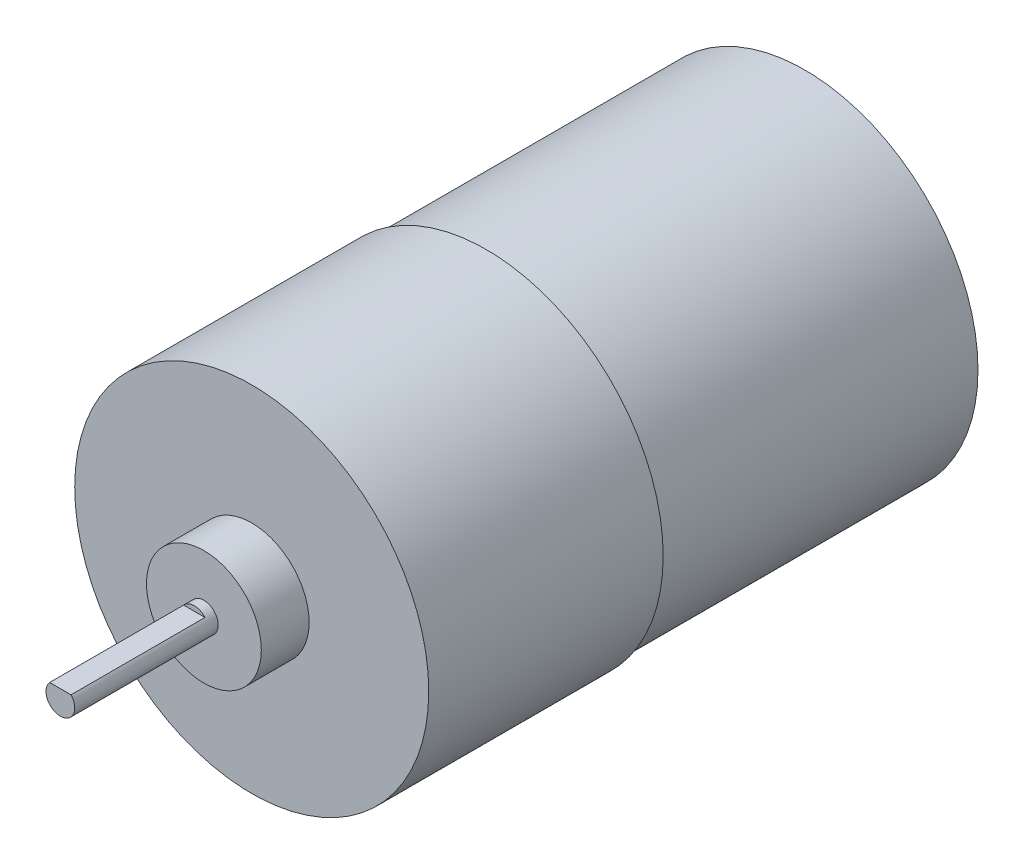
ISO-10303-21;
HEADER;
FILE_DESCRIPTION(('STEP AP214'),'2;1');
FILE_NAME('part.step','',(''),(''),'','','');
FILE_SCHEMA(('AUTOMOTIVE_DESIGN { 1 0 10303 214 1 1 1 1 }'));
ENDSEC;
DATA;
#1=APPLICATION_CONTEXT('core data for automotive mechanical design processes');
#2=APPLICATION_PROTOCOL_DEFINITION('international standard','automotive_design',2000,#1);
#3=PRODUCT_CONTEXT('',#1,'mechanical');
#4=PRODUCT('Part','Part','',(#3));
#5=PRODUCT_RELATED_PRODUCT_CATEGORY('part','',(#4));
#6=PRODUCT_DEFINITION_FORMATION('','',#4);
#7=PRODUCT_DEFINITION_CONTEXT('part definition',#1,'design');
#8=PRODUCT_DEFINITION('design','',#6,#7);
#9=PRODUCT_DEFINITION_SHAPE('','',#8);
#10=(LENGTH_UNIT() NAMED_UNIT(*) SI_UNIT(.MILLI.,.METRE.));
#11=(NAMED_UNIT(*) PLANE_ANGLE_UNIT() SI_UNIT($,.RADIAN.));
#12=(NAMED_UNIT(*) SI_UNIT($,.STERADIAN.) SOLID_ANGLE_UNIT());
#13=UNCERTAINTY_MEASURE_WITH_UNIT(LENGTH_MEASURE(1.E-05),#10,'distance_accuracy_value','');
#14=(GEOMETRIC_REPRESENTATION_CONTEXT(3) GLOBAL_UNCERTAINTY_ASSIGNED_CONTEXT((#13)) GLOBAL_UNIT_ASSIGNED_CONTEXT((#10,
#11,#12)) REPRESENTATION_CONTEXT('',''));
#15=CARTESIAN_POINT('',(0.,0.,0.));
#16=DIRECTION('',(0.,0.,1.));
#17=DIRECTION('',(1.,0.,0.));
#18=AXIS2_PLACEMENT_3D('',#15,#16,#17);
#19=CARTESIAN_POINT('',(0.,0.,33.3));
#20=DIRECTION('',(0.,0.,-1.));
#21=DIRECTION('',(-1.,0.,0.));
#22=AXIS2_PLACEMENT_3D('',#19,#20,#21);
#23=CYLINDRICAL_SURFACE('',#22,18.099999995);
#24=CARTESIAN_POINT('',(0.,0.,33.3));
#25=DIRECTION('',(0.,0.,1.));
#26=DIRECTION('',(1.,0.,0.));
#27=AXIS2_PLACEMENT_3D('',#24,#25,#26);
#28=CIRCLE('',#27,18.099999995);
#29=CARTESIAN_POINT('',(18.099999995,0.,33.3));
#30=VERTEX_POINT('',#29);
#31=EDGE_CURVE('E82',#30,#30,#28,.T.);
#32=ORIENTED_EDGE('',*,*,#31,.F.);
#33=EDGE_LOOP('',(#32));
#34=FACE_BOUND('',#33,.T.);
#35=CARTESIAN_POINT('',(0.,0.,0.));
#36=DIRECTION('',(0.,0.,1.));
#37=DIRECTION('',(1.,0.,0.));
#38=AXIS2_PLACEMENT_3D('',#35,#36,#37);
#39=CIRCLE('',#38,18.099999995);
#40=CARTESIAN_POINT('',(18.099999995,0.,0.));
#41=VERTEX_POINT('',#40);
#42=EDGE_CURVE('E35',#41,#41,#39,.T.);
#43=ORIENTED_EDGE('',*,*,#42,.T.);
#44=EDGE_LOOP('',(#43));
#45=FACE_BOUND('',#44,.T.);
#46=ADVANCED_FACE('F32',(#34,#45),#23,.T.);
#47=CARTESIAN_POINT('',(0.,0.,0.));
#48=DIRECTION('',(0.,0.,1.));
#49=DIRECTION('',(1.,0.,0.));
#50=AXIS2_PLACEMENT_3D('',#47,#48,#49);
#51=PLANE('',#50);
#52=ORIENTED_EDGE('',*,*,#42,.F.);
#53=EDGE_LOOP('',(#52));
#54=FACE_BOUND('',#53,.T.);
#55=ADVANCED_FACE('F94',(#54),#51,.F.);
#56=CARTESIAN_POINT('',(0.,0.,57.8));
#57=DIRECTION('',(0.,0.,-1.));
#58=DIRECTION('',(-1.,0.,0.));
#59=AXIS2_PLACEMENT_3D('',#56,#57,#58);
#60=CYLINDRICAL_SURFACE('',#59,18.5);
#61=CARTESIAN_POINT('',(0.,0.,57.8));
#62=DIRECTION('',(0.,0.,1.));
#63=DIRECTION('',(1.,0.,0.));
#64=AXIS2_PLACEMENT_3D('',#61,#62,#63);
#65=CIRCLE('',#64,18.5);
#66=CARTESIAN_POINT('',(18.5,0.,57.8));
#67=VERTEX_POINT('',#66);
#68=EDGE_CURVE('E83',#67,#67,#65,.T.);
#69=ORIENTED_EDGE('',*,*,#68,.F.);
#70=EDGE_LOOP('',(#69));
#71=FACE_BOUND('',#70,.T.);
#72=CARTESIAN_POINT('',(0.,0.,33.3));
#73=DIRECTION('',(0.,0.,1.));
#74=DIRECTION('',(1.,0.,0.));
#75=AXIS2_PLACEMENT_3D('',#72,#73,#74);
#76=CIRCLE('',#75,18.5);
#77=CARTESIAN_POINT('',(18.5,0.,33.3));
#78=VERTEX_POINT('',#77);
#79=EDGE_CURVE('E76',#78,#78,#76,.T.);
#80=ORIENTED_EDGE('',*,*,#79,.T.);
#81=EDGE_LOOP('',(#80));
#82=FACE_BOUND('',#81,.T.);
#83=ADVANCED_FACE('F96',(#71,#82),#60,.T.);
#84=CARTESIAN_POINT('',(0.,0.,57.8));
#85=DIRECTION('',(0.,0.,1.));
#86=DIRECTION('',(1.,0.,0.));
#87=AXIS2_PLACEMENT_3D('',#84,#85,#86);
#88=PLANE('',#87);
#89=CARTESIAN_POINT('',(0.,0.,57.8));
#90=DIRECTION('',(0.,0.,1.));
#91=DIRECTION('',(1.,0.,0.));
#92=AXIS2_PLACEMENT_3D('',#89,#90,#91);
#93=CIRCLE('',#92,5.999999938);
#94=CARTESIAN_POINT('',(5.999999938,0.,57.8));
#95=VERTEX_POINT('',#94);
#96=EDGE_CURVE('E40',#95,#95,#93,.T.);
#97=ORIENTED_EDGE('',*,*,#96,.F.);
#98=EDGE_LOOP('',(#97));
#99=FACE_BOUND('',#98,.T.);
#100=ORIENTED_EDGE('',*,*,#68,.T.);
#101=EDGE_LOOP('',(#100));
#102=FACE_BOUND('',#101,.T.);
#103=ADVANCED_FACE('F101',(#99,#102),#88,.T.);
#104=CARTESIAN_POINT('',(0.,0.,33.3));
#105=DIRECTION('',(0.,0.,1.));
#106=DIRECTION('',(1.,0.,0.));
#107=AXIS2_PLACEMENT_3D('',#104,#105,#106);
#108=PLANE('',#107);
#109=ORIENTED_EDGE('',*,*,#31,.T.);
#110=EDGE_LOOP('',(#109));
#111=FACE_BOUND('',#110,.T.);
#112=ORIENTED_EDGE('',*,*,#79,.F.);
#113=EDGE_LOOP('',(#112));
#114=FACE_BOUND('',#113,.T.);
#115=ADVANCED_FACE('F106',(#111,#114),#108,.F.);
#116=CARTESIAN_POINT('',(0.,0.,62.8));
#117=DIRECTION('',(0.,0.,-1.));
#118=DIRECTION('',(-1.,0.,0.));
#119=AXIS2_PLACEMENT_3D('',#116,#117,#118);
#120=CYLINDRICAL_SURFACE('',#119,5.999999938);
#121=CARTESIAN_POINT('',(0.,0.,62.8));
#122=DIRECTION('',(0.,0.,1.));
#123=DIRECTION('',(1.,0.,0.));
#124=AXIS2_PLACEMENT_3D('',#121,#122,#123);
#125=CIRCLE('',#124,5.999999938);
#126=CARTESIAN_POINT('',(5.999999938,0.,62.8));
#127=VERTEX_POINT('',#126);
#128=EDGE_CURVE('E73',#127,#127,#125,.T.);
#129=ORIENTED_EDGE('',*,*,#128,.F.);
#130=EDGE_LOOP('',(#129));
#131=FACE_BOUND('',#130,.T.);
#132=ORIENTED_EDGE('',*,*,#96,.T.);
#133=EDGE_LOOP('',(#132));
#134=FACE_BOUND('',#133,.T.);
#135=ADVANCED_FACE('F109',(#131,#134),#120,.T.);
#136=CARTESIAN_POINT('',(0.,0.,62.8));
#137=DIRECTION('',(0.,0.,1.));
#138=DIRECTION('',(1.,0.,0.));
#139=AXIS2_PLACEMENT_3D('',#136,#137,#138);
#140=PLANE('',#139);
#141=CARTESIAN_POINT('',(0.,0.,62.8));
#142=DIRECTION('',(0.,0.,1.));
#143=DIRECTION('',(1.,0.,0.));
#144=AXIS2_PLACEMENT_3D('',#141,#142,#143);
#145=CIRCLE('',#144,1.500000048);
#146=CARTESIAN_POINT('',(1.500000048,0.,62.8));
#147=VERTEX_POINT('',#146);
#148=EDGE_CURVE('E11',#147,#147,#145,.T.);
#149=ORIENTED_EDGE('',*,*,#148,.F.);
#150=EDGE_LOOP('',(#149));
#151=FACE_BOUND('',#150,.T.);
#152=ORIENTED_EDGE('',*,*,#128,.T.);
#153=EDGE_LOOP('',(#152));
#154=FACE_BOUND('',#153,.T.);
#155=ADVANCED_FACE('F115',(#151,#154),#140,.T.);
#156=CARTESIAN_POINT('',(0.,0.,77.8));
#157=DIRECTION('',(0.,0.,-1.));
#158=DIRECTION('',(-1.,0.,0.));
#159=AXIS2_PLACEMENT_3D('',#156,#157,#158);
#160=CYLINDRICAL_SURFACE('',#159,1.500000048);
#161=CARTESIAN_POINT('',(0.,0.,77.8));
#162=DIRECTION('',(0.,0.,1.));
#163=DIRECTION('',(1.,0.,0.));
#164=AXIS2_PLACEMENT_3D('',#161,#162,#163);
#165=CIRCLE('',#164,1.500000048);
#166=CARTESIAN_POINT('',(-1.11803402452698,1.000000032,77.8));
#167=VERTEX_POINT('',#166);
#168=CARTESIAN_POINT('',(1.11803402452698,1.000000032,77.8));
#169=VERTEX_POINT('',#168);
#170=EDGE_CURVE('E70',#167,#169,#165,.T.);
#171=ORIENTED_EDGE('',*,*,#170,.F.);
#172=DIRECTION('',(0.,0.,1.));
#173=VECTOR('',#172,1.);
#174=CARTESIAN_POINT('',(-1.11803402452698,1.000000032,63.8));
#175=LINE('',#174,#173);
#176=CARTESIAN_POINT('',(-1.11803402452698,1.000000032,63.8));
#177=VERTEX_POINT('',#176);
#178=EDGE_CURVE('E48',#177,#167,#175,.T.);
#179=ORIENTED_EDGE('',*,*,#178,.F.);
#180=CARTESIAN_POINT('',(0.,0.,63.8));
#181=DIRECTION('',(0.,0.,1.));
#182=DIRECTION('',(1.,0.,0.));
#183=AXIS2_PLACEMENT_3D('',#180,#181,#182);
#184=CIRCLE('',#183,1.500000048);
#185=CARTESIAN_POINT('',(1.11803402452698,1.000000032,63.8));
#186=VERTEX_POINT('',#185);
#187=EDGE_CURVE('E64',#186,#177,#184,.T.);
#188=ORIENTED_EDGE('',*,*,#187,.F.);
#189=DIRECTION('',(0.,0.,1.));
#190=VECTOR('',#189,1.);
#191=CARTESIAN_POINT('',(1.11803402452698,1.000000032,63.8));
#192=LINE('',#191,#190);
#193=EDGE_CURVE('E54',#186,#169,#192,.T.);
#194=ORIENTED_EDGE('',*,*,#193,.T.);
#195=EDGE_LOOP('',(#171,#179,#188,#194));
#196=FACE_BOUND('',#195,.T.);
#197=ORIENTED_EDGE('',*,*,#148,.T.);
#198=EDGE_LOOP('',(#197));
#199=FACE_BOUND('',#198,.T.);
#200=ADVANCED_FACE('F68',(#196,#199),#160,.T.);
#201=CARTESIAN_POINT('',(0.,0.,77.8));
#202=DIRECTION('',(0.,0.,1.));
#203=DIRECTION('',(1.,0.,0.));
#204=AXIS2_PLACEMENT_3D('',#201,#202,#203);
#205=PLANE('',#204);
#206=DIRECTION('',(1.,0.,0.));
#207=VECTOR('',#206,1.);
#208=CARTESIAN_POINT('',(-1.11803402452698,1.000000032,77.8));
#209=LINE('',#208,#207);
#210=EDGE_CURVE('E59',#167,#169,#209,.T.);
#211=ORIENTED_EDGE('',*,*,#210,.F.);
#212=ORIENTED_EDGE('',*,*,#170,.T.);
#213=EDGE_LOOP('',(#211,#212));
#214=FACE_BOUND('',#213,.T.);
#215=ADVANCED_FACE('F72',(#214),#205,.T.);
#216=CARTESIAN_POINT('',(-1.11803402452698,1.000000032,63.8));
#217=DIRECTION('',(0.,-1.,0.));
#218=DIRECTION('',(0.,0.,-1.));
#219=AXIS2_PLACEMENT_3D('',#216,#217,#218);
#220=PLANE('',#219);
#221=ORIENTED_EDGE('',*,*,#210,.T.);
#222=ORIENTED_EDGE('',*,*,#193,.F.);
#223=DIRECTION('',(1.,0.,0.));
#224=VECTOR('',#223,1.);
#225=CARTESIAN_POINT('',(-1.11803402452698,1.000000032,63.8));
#226=LINE('',#225,#224);
#227=EDGE_CURVE('E131',#177,#186,#226,.T.);
#228=ORIENTED_EDGE('',*,*,#227,.F.);
#229=ORIENTED_EDGE('',*,*,#178,.T.);
#230=EDGE_LOOP('',(#221,#222,#228,#229));
#231=FACE_BOUND('',#230,.T.);
#232=ADVANCED_FACE('F60',(#231),#220,.F.);
#233=CARTESIAN_POINT('',(0.,0.,63.8));
#234=DIRECTION('',(0.,0.,1.));
#235=DIRECTION('',(1.,0.,0.));
#236=AXIS2_PLACEMENT_3D('',#233,#234,#235);
#237=PLANE('',#236);
#238=ORIENTED_EDGE('',*,*,#187,.T.);
#239=ORIENTED_EDGE('',*,*,#227,.T.);
#240=EDGE_LOOP('',(#238,#239));
#241=FACE_BOUND('',#240,.T.);
#242=ADVANCED_FACE('F126',(#241),#237,.T.);
#243=CLOSED_SHELL('',(#46,#55,#83,#103,#115,#135,#155,#200,#215,#232,#242));
#244=MANIFOLD_SOLID_BREP('B2',#243);
#245=ADVANCED_BREP_SHAPE_REPRESENTATION('',(#18,#244),#14);
#246=SHAPE_DEFINITION_REPRESENTATION(#9,#245);
ENDSEC;
END-ISO-10303-21;
